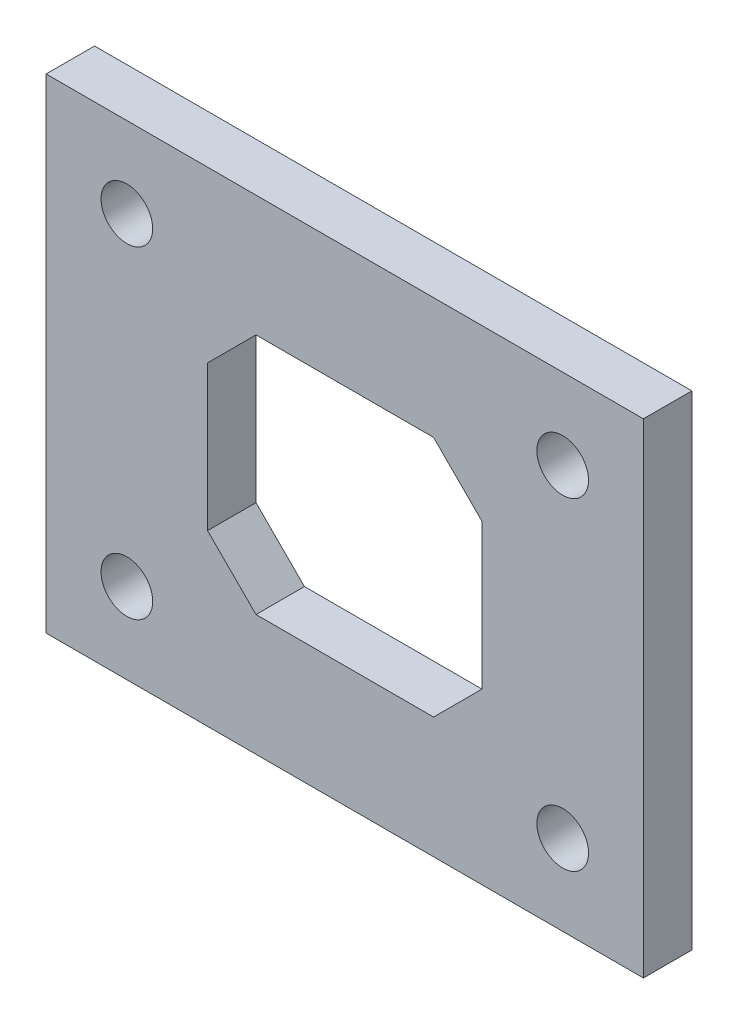
ISO-10303-21;
HEADER;
FILE_DESCRIPTION(('STEP AP214'),'2;1');
FILE_NAME('part.step','',(''),(''),'','','');
FILE_SCHEMA(('AUTOMOTIVE_DESIGN { 1 0 10303 214 1 1 1 1 }'));
ENDSEC;
DATA;
#1=APPLICATION_CONTEXT('core data for automotive mechanical design processes');
#2=APPLICATION_PROTOCOL_DEFINITION('international standard','automotive_design',2000,#1);
#3=PRODUCT_CONTEXT('',#1,'mechanical');
#4=PRODUCT('Part','Part','',(#3));
#5=PRODUCT_RELATED_PRODUCT_CATEGORY('part','',(#4));
#6=PRODUCT_DEFINITION_FORMATION('','',#4);
#7=PRODUCT_DEFINITION_CONTEXT('part definition',#1,'design');
#8=PRODUCT_DEFINITION('design','',#6,#7);
#9=PRODUCT_DEFINITION_SHAPE('','',#8);
#10=(LENGTH_UNIT() NAMED_UNIT(*) SI_UNIT(.MILLI.,.METRE.));
#11=(NAMED_UNIT(*) PLANE_ANGLE_UNIT() SI_UNIT($,.RADIAN.));
#12=(NAMED_UNIT(*) SI_UNIT($,.STERADIAN.) SOLID_ANGLE_UNIT());
#13=UNCERTAINTY_MEASURE_WITH_UNIT(LENGTH_MEASURE(1.E-05),#10,'distance_accuracy_value','');
#14=(GEOMETRIC_REPRESENTATION_CONTEXT(3) GLOBAL_UNCERTAINTY_ASSIGNED_CONTEXT((#13)) GLOBAL_UNIT_ASSIGNED_CONTEXT((#10,
#11,#12)) REPRESENTATION_CONTEXT('',''));
#15=CARTESIAN_POINT('',(0.,0.,0.));
#16=DIRECTION('',(0.,0.,1.));
#17=DIRECTION('',(1.,0.,0.));
#18=AXIS2_PLACEMENT_3D('',#15,#16,#17);
#19=CARTESIAN_POINT('',(18.5,0.,3.));
#20=DIRECTION('',(-1.,0.,0.));
#21=DIRECTION('',(0.,0.,1.));
#22=AXIS2_PLACEMENT_3D('',#19,#20,#21);
#23=PLANE('',#22);
#24=DIRECTION('',(0.,1.,0.));
#25=VECTOR('',#24,1.);
#26=CARTESIAN_POINT('',(18.5,0.,3.));
#27=LINE('',#26,#25);
#28=CARTESIAN_POINT('',(18.5,30.,3.));
#29=VERTEX_POINT('',#28);
#30=CARTESIAN_POINT('',(18.5,60.,3.));
#31=VERTEX_POINT('',#30);
#32=EDGE_CURVE('E143',#29,#31,#27,.T.);
#33=ORIENTED_EDGE('',*,*,#32,.F.);
#34=DIRECTION('',(0.,0.,1.));
#35=VECTOR('',#34,1.);
#36=CARTESIAN_POINT('',(18.5,30.,0.));
#37=LINE('',#36,#35);
#38=CARTESIAN_POINT('',(18.5,30.,0.));
#39=VERTEX_POINT('',#38);
#40=EDGE_CURVE('E129',#39,#29,#37,.T.);
#41=ORIENTED_EDGE('',*,*,#40,.F.);
#42=DIRECTION('',(0.,1.,0.));
#43=VECTOR('',#42,1.);
#44=CARTESIAN_POINT('',(18.5,0.,0.));
#45=LINE('',#44,#43);
#46=CARTESIAN_POINT('',(18.5,60.,0.));
#47=VERTEX_POINT('',#46);
#48=EDGE_CURVE('E141',#39,#47,#45,.T.);
#49=ORIENTED_EDGE('',*,*,#48,.T.);
#50=DIRECTION('',(0.,0.,-1.));
#51=VECTOR('',#50,1.);
#52=CARTESIAN_POINT('',(18.5,60.,3.));
#53=LINE('',#52,#51);
#54=EDGE_CURVE('E163',#31,#47,#53,.T.);
#55=ORIENTED_EDGE('',*,*,#54,.F.);
#56=EDGE_LOOP('',(#33,#41,#49,#55));
#57=FACE_BOUND('',#56,.T.);
#58=ADVANCED_FACE('F37',(#57),#23,.F.);
#59=CARTESIAN_POINT('',(0.,60.,3.));
#60=DIRECTION('',(0.,1.,0.));
#61=DIRECTION('',(0.,0.,1.));
#62=AXIS2_PLACEMENT_3D('',#59,#60,#61);
#63=PLANE('',#62);
#64=DIRECTION('',(1.,0.,0.));
#65=VECTOR('',#64,1.);
#66=CARTESIAN_POINT('',(0.,60.,0.));
#67=LINE('',#66,#65);
#68=CARTESIAN_POINT('',(-18.5,60.,0.));
#69=VERTEX_POINT('',#68);
#70=EDGE_CURVE('E148',#69,#47,#67,.T.);
#71=ORIENTED_EDGE('',*,*,#70,.F.);
#72=DIRECTION('',(0.,0.,-1.));
#73=VECTOR('',#72,1.);
#74=CARTESIAN_POINT('',(-18.5,60.,3.));
#75=LINE('',#74,#73);
#76=CARTESIAN_POINT('',(-18.5,60.,3.));
#77=VERTEX_POINT('',#76);
#78=EDGE_CURVE('E160',#77,#69,#75,.T.);
#79=ORIENTED_EDGE('',*,*,#78,.F.);
#80=DIRECTION('',(1.,0.,0.));
#81=VECTOR('',#80,1.);
#82=CARTESIAN_POINT('',(0.,60.,3.));
#83=LINE('',#82,#81);
#84=EDGE_CURVE('E244',#77,#31,#83,.T.);
#85=ORIENTED_EDGE('',*,*,#84,.T.);
#86=ORIENTED_EDGE('',*,*,#54,.T.);
#87=EDGE_LOOP('',(#71,#79,#85,#86));
#88=FACE_BOUND('',#87,.T.);
#89=ADVANCED_FACE('F270',(#88),#63,.T.);
#90=CARTESIAN_POINT('',(-13.5,55.,3.));
#91=DIRECTION('',(0.,0.,-1.));
#92=DIRECTION('',(-1.,0.,0.));
#93=AXIS2_PLACEMENT_3D('',#90,#91,#92);
#94=CYLINDRICAL_SURFACE('',#93,1.6);
#95=CARTESIAN_POINT('',(-13.5,55.,3.));
#96=DIRECTION('',(0.,0.,1.));
#97=DIRECTION('',(1.,0.,0.));
#98=AXIS2_PLACEMENT_3D('',#95,#96,#97);
#99=CIRCLE('',#98,1.6);
#100=CARTESIAN_POINT('',(-11.9,55.,3.));
#101=VERTEX_POINT('',#100);
#102=EDGE_CURVE('E240',#101,#101,#99,.T.);
#103=ORIENTED_EDGE('',*,*,#102,.T.);
#104=EDGE_LOOP('',(#103));
#105=FACE_BOUND('',#104,.T.);
#106=CARTESIAN_POINT('',(-13.5,55.,0.));
#107=DIRECTION('',(0.,0.,1.));
#108=DIRECTION('',(1.,0.,0.));
#109=AXIS2_PLACEMENT_3D('',#106,#107,#108);
#110=CIRCLE('',#109,1.6);
#111=CARTESIAN_POINT('',(-11.9,55.,0.));
#112=VERTEX_POINT('',#111);
#113=EDGE_CURVE('E149',#112,#112,#110,.T.);
#114=ORIENTED_EDGE('',*,*,#113,.F.);
#115=EDGE_LOOP('',(#114));
#116=FACE_BOUND('',#115,.T.);
#117=ADVANCED_FACE('F260',(#105,#116),#94,.F.);
#118=CARTESIAN_POINT('',(-13.5,35.,3.));
#119=DIRECTION('',(0.,0.,-1.));
#120=DIRECTION('',(-1.,0.,0.));
#121=AXIS2_PLACEMENT_3D('',#118,#119,#120);
#122=CYLINDRICAL_SURFACE('',#121,1.6);
#123=CARTESIAN_POINT('',(-13.5,35.,3.));
#124=DIRECTION('',(0.,0.,1.));
#125=DIRECTION('',(1.,0.,0.));
#126=AXIS2_PLACEMENT_3D('',#123,#124,#125);
#127=CIRCLE('',#126,1.6);
#128=CARTESIAN_POINT('',(-11.9,35.,3.));
#129=VERTEX_POINT('',#128);
#130=EDGE_CURVE('E237',#129,#129,#127,.T.);
#131=ORIENTED_EDGE('',*,*,#130,.T.);
#132=EDGE_LOOP('',(#131));
#133=FACE_BOUND('',#132,.T.);
#134=CARTESIAN_POINT('',(-13.5,35.,0.));
#135=DIRECTION('',(0.,0.,1.));
#136=DIRECTION('',(1.,0.,0.));
#137=AXIS2_PLACEMENT_3D('',#134,#135,#136);
#138=CIRCLE('',#137,1.6);
#139=CARTESIAN_POINT('',(-11.9,35.,0.));
#140=VERTEX_POINT('',#139);
#141=EDGE_CURVE('E154',#140,#140,#138,.T.);
#142=ORIENTED_EDGE('',*,*,#141,.F.);
#143=EDGE_LOOP('',(#142));
#144=FACE_BOUND('',#143,.T.);
#145=ADVANCED_FACE('F257',(#133,#144),#122,.F.);
#146=CARTESIAN_POINT('',(13.5,55.,3.));
#147=DIRECTION('',(0.,0.,-1.));
#148=DIRECTION('',(-1.,0.,0.));
#149=AXIS2_PLACEMENT_3D('',#146,#147,#148);
#150=CYLINDRICAL_SURFACE('',#149,1.6);
#151=CARTESIAN_POINT('',(13.5,55.,3.));
#152=DIRECTION('',(0.,0.,1.));
#153=DIRECTION('',(1.,0.,0.));
#154=AXIS2_PLACEMENT_3D('',#151,#152,#153);
#155=CIRCLE('',#154,1.6);
#156=CARTESIAN_POINT('',(15.1,55.,3.));
#157=VERTEX_POINT('',#156);
#158=EDGE_CURVE('E234',#157,#157,#155,.T.);
#159=ORIENTED_EDGE('',*,*,#158,.T.);
#160=EDGE_LOOP('',(#159));
#161=FACE_BOUND('',#160,.T.);
#162=CARTESIAN_POINT('',(13.5,55.,0.));
#163=DIRECTION('',(0.,0.,1.));
#164=DIRECTION('',(1.,0.,0.));
#165=AXIS2_PLACEMENT_3D('',#162,#163,#164);
#166=CIRCLE('',#165,1.6);
#167=CARTESIAN_POINT('',(15.1,55.,0.));
#168=VERTEX_POINT('',#167);
#169=EDGE_CURVE('E250',#168,#168,#166,.T.);
#170=ORIENTED_EDGE('',*,*,#169,.F.);
#171=EDGE_LOOP('',(#170));
#172=FACE_BOUND('',#171,.T.);
#173=ADVANCED_FACE('F259',(#161,#172),#150,.F.);
#174=CARTESIAN_POINT('',(13.5,35.,3.));
#175=DIRECTION('',(0.,0.,-1.));
#176=DIRECTION('',(-1.,0.,0.));
#177=AXIS2_PLACEMENT_3D('',#174,#175,#176);
#178=CYLINDRICAL_SURFACE('',#177,1.6);
#179=CARTESIAN_POINT('',(13.5,35.,3.));
#180=DIRECTION('',(0.,0.,1.));
#181=DIRECTION('',(1.,0.,0.));
#182=AXIS2_PLACEMENT_3D('',#179,#180,#181);
#183=CIRCLE('',#182,1.6);
#184=CARTESIAN_POINT('',(15.1,35.,3.));
#185=VERTEX_POINT('',#184);
#186=EDGE_CURVE('E159',#185,#185,#183,.T.);
#187=ORIENTED_EDGE('',*,*,#186,.T.);
#188=EDGE_LOOP('',(#187));
#189=FACE_BOUND('',#188,.T.);
#190=CARTESIAN_POINT('',(13.5,35.,0.));
#191=DIRECTION('',(0.,0.,1.));
#192=DIRECTION('',(1.,0.,0.));
#193=AXIS2_PLACEMENT_3D('',#190,#191,#192);
#194=CIRCLE('',#193,1.6);
#195=CARTESIAN_POINT('',(15.1,35.,0.));
#196=VERTEX_POINT('',#195);
#197=EDGE_CURVE('E230',#196,#196,#194,.T.);
#198=ORIENTED_EDGE('',*,*,#197,.F.);
#199=EDGE_LOOP('',(#198));
#200=FACE_BOUND('',#199,.T.);
#201=ADVANCED_FACE('F267',(#189,#200),#178,.F.);
#202=CARTESIAN_POINT('',(-18.5,0.,3.));
#203=DIRECTION('',(-1.,0.,0.));
#204=DIRECTION('',(0.,0.,1.));
#205=AXIS2_PLACEMENT_3D('',#202,#203,#204);
#206=PLANE('',#205);
#207=DIRECTION('',(0.,0.,1.));
#208=VECTOR('',#207,1.);
#209=CARTESIAN_POINT('',(-18.5,30.,0.));
#210=LINE('',#209,#208);
#211=CARTESIAN_POINT('',(-18.5,30.,0.));
#212=VERTEX_POINT('',#211);
#213=CARTESIAN_POINT('',(-18.5,30.,3.));
#214=VERTEX_POINT('',#213);
#215=EDGE_CURVE('E132',#212,#214,#210,.T.);
#216=ORIENTED_EDGE('',*,*,#215,.T.);
#217=DIRECTION('',(0.,1.,0.));
#218=VECTOR('',#217,1.);
#219=CARTESIAN_POINT('',(-18.5,0.,3.));
#220=LINE('',#219,#218);
#221=EDGE_CURVE('E164',#214,#77,#220,.T.);
#222=ORIENTED_EDGE('',*,*,#221,.T.);
#223=ORIENTED_EDGE('',*,*,#78,.T.);
#224=DIRECTION('',(0.,1.,0.));
#225=VECTOR('',#224,1.);
#226=CARTESIAN_POINT('',(-18.5,0.,0.));
#227=LINE('',#226,#225);
#228=EDGE_CURVE('E151',#212,#69,#227,.T.);
#229=ORIENTED_EDGE('',*,*,#228,.F.);
#230=EDGE_LOOP('',(#216,#222,#223,#229));
#231=FACE_BOUND('',#230,.T.);
#232=ADVANCED_FACE('F281',(#231),#206,.T.);
#233=CARTESIAN_POINT('',(0.,0.,3.));
#234=DIRECTION('',(0.,0.,1.));
#235=DIRECTION('',(1.,0.,0.));
#236=AXIS2_PLACEMENT_3D('',#233,#234,#235);
#237=PLANE('',#236);
#238=DIRECTION('',(1.,0.,0.));
#239=VECTOR('',#238,1.);
#240=CARTESIAN_POINT('',(8.50000000000001,52.5,3.));
#241=LINE('',#240,#239);
#242=CARTESIAN_POINT('',(-5.49999999999998,52.5,3.));
#243=VERTEX_POINT('',#242);
#244=CARTESIAN_POINT('',(5.50000000000001,52.5,3.));
#245=VERTEX_POINT('',#244);
#246=EDGE_CURVE('E214',#243,#245,#241,.T.);
#247=ORIENTED_EDGE('',*,*,#246,.T.);
#248=DIRECTION('',(-0.707106781186542,0.707106781186553,0.));
#249=VECTOR('',#248,1.);
#250=CARTESIAN_POINT('',(8.5,49.5,3.));
#251=LINE('',#250,#249);
#252=CARTESIAN_POINT('',(8.5,49.5,3.));
#253=VERTEX_POINT('',#252);
#254=EDGE_CURVE('E195',#245,#253,#251,.F.);
#255=ORIENTED_EDGE('',*,*,#254,.T.);
#256=DIRECTION('',(0.,-1.,0.));
#257=VECTOR('',#256,1.);
#258=CARTESIAN_POINT('',(8.50000000000001,52.5,3.));
#259=LINE('',#258,#257);
#260=CARTESIAN_POINT('',(8.5,40.5,3.));
#261=VERTEX_POINT('',#260);
#262=EDGE_CURVE('E228',#253,#261,#259,.T.);
#263=ORIENTED_EDGE('',*,*,#262,.T.);
#264=DIRECTION('',(0.707106781186552,0.707106781186543,0.));
#265=VECTOR('',#264,1.);
#266=CARTESIAN_POINT('',(5.49999999999998,37.5,3.));
#267=LINE('',#266,#265);
#268=CARTESIAN_POINT('',(5.49999999999998,37.5,3.));
#269=VERTEX_POINT('',#268);
#270=EDGE_CURVE('E191',#261,#269,#267,.F.);
#271=ORIENTED_EDGE('',*,*,#270,.T.);
#272=DIRECTION('',(-1.,0.,0.));
#273=VECTOR('',#272,1.);
#274=CARTESIAN_POINT('',(8.5,37.5,3.));
#275=LINE('',#274,#273);
#276=CARTESIAN_POINT('',(-5.50000000000002,37.5,3.));
#277=VERTEX_POINT('',#276);
#278=EDGE_CURVE('E219',#269,#277,#275,.T.);
#279=ORIENTED_EDGE('',*,*,#278,.T.);
#280=DIRECTION('',(0.707106781186543,-0.707106781186552,0.));
#281=VECTOR('',#280,1.);
#282=CARTESIAN_POINT('',(-8.5,40.5,3.));
#283=LINE('',#282,#281);
#284=CARTESIAN_POINT('',(-8.5,40.5,3.));
#285=VERTEX_POINT('',#284);
#286=EDGE_CURVE('E187',#277,#285,#283,.F.);
#287=ORIENTED_EDGE('',*,*,#286,.T.);
#288=DIRECTION('',(0.,1.,0.));
#289=VECTOR('',#288,1.);
#290=CARTESIAN_POINT('',(-8.49999999999999,52.5,3.));
#291=LINE('',#290,#289);
#292=CARTESIAN_POINT('',(-8.5,49.5,3.));
#293=VERTEX_POINT('',#292);
#294=EDGE_CURVE('E216',#285,#293,#291,.T.);
#295=ORIENTED_EDGE('',*,*,#294,.T.);
#296=DIRECTION('',(-0.707106781186552,-0.707106781186543,0.));
#297=VECTOR('',#296,1.);
#298=CARTESIAN_POINT('',(-5.49999999999997,52.5,3.));
#299=LINE('',#298,#297);
#300=EDGE_CURVE('E11',#293,#243,#299,.F.);
#301=ORIENTED_EDGE('',*,*,#300,.T.);
#302=EDGE_LOOP('',(#247,#255,#263,#271,#279,#287,#295,#301));
#303=FACE_BOUND('',#302,.T.);
#304=DIRECTION('',(-1.,0.,0.));
#305=VECTOR('',#304,1.);
#306=CARTESIAN_POINT('',(-18.5,30.,3.));
#307=LINE('',#306,#305);
#308=EDGE_CURVE('E136',#29,#214,#307,.T.);
#309=ORIENTED_EDGE('',*,*,#308,.F.);
#310=ORIENTED_EDGE('',*,*,#32,.T.);
#311=ORIENTED_EDGE('',*,*,#84,.F.);
#312=ORIENTED_EDGE('',*,*,#221,.F.);
#313=EDGE_LOOP('',(#309,#310,#311,#312));
#314=FACE_BOUND('',#313,.T.);
#315=ORIENTED_EDGE('',*,*,#186,.F.);
#316=EDGE_LOOP('',(#315));
#317=FACE_BOUND('',#316,.T.);
#318=ORIENTED_EDGE('',*,*,#158,.F.);
#319=EDGE_LOOP('',(#318));
#320=FACE_BOUND('',#319,.T.);
#321=ORIENTED_EDGE('',*,*,#130,.F.);
#322=EDGE_LOOP('',(#321));
#323=FACE_BOUND('',#322,.T.);
#324=ORIENTED_EDGE('',*,*,#102,.F.);
#325=EDGE_LOOP('',(#324));
#326=FACE_BOUND('',#325,.T.);
#327=ADVANCED_FACE('F284',(#303,#314,#317,#320,#323,#326),#237,.T.);
#328=CARTESIAN_POINT('',(0.,0.,0.));
#329=DIRECTION('',(0.,0.,1.));
#330=DIRECTION('',(1.,0.,0.));
#331=AXIS2_PLACEMENT_3D('',#328,#329,#330);
#332=PLANE('',#331);
#333=DIRECTION('',(-1.,0.,0.));
#334=VECTOR('',#333,1.);
#335=CARTESIAN_POINT('',(8.5,37.5,0.));
#336=LINE('',#335,#334);
#337=CARTESIAN_POINT('',(5.49999999999998,37.5,0.));
#338=VERTEX_POINT('',#337);
#339=CARTESIAN_POINT('',(-5.50000000000002,37.5,0.));
#340=VERTEX_POINT('',#339);
#341=EDGE_CURVE('E211',#338,#340,#336,.T.);
#342=ORIENTED_EDGE('',*,*,#341,.F.);
#343=DIRECTION('',(-0.707106781186552,-0.707106781186543,0.));
#344=VECTOR('',#343,1.);
#345=CARTESIAN_POINT('',(-16.,16.0000000000002,0.));
#346=LINE('',#345,#344);
#347=CARTESIAN_POINT('',(8.5,40.5,0.));
#348=VERTEX_POINT('',#347);
#349=EDGE_CURVE('E189',#338,#348,#346,.F.);
#350=ORIENTED_EDGE('',*,*,#349,.T.);
#351=DIRECTION('',(0.,-1.,0.));
#352=VECTOR('',#351,1.);
#353=CARTESIAN_POINT('',(8.50000000000001,52.5,0.));
#354=LINE('',#353,#352);
#355=CARTESIAN_POINT('',(8.5,49.5,0.));
#356=VERTEX_POINT('',#355);
#357=EDGE_CURVE('E223',#356,#348,#354,.T.);
#358=ORIENTED_EDGE('',*,*,#357,.F.);
#359=DIRECTION('',(0.707106781186542,-0.707106781186553,0.));
#360=VECTOR('',#359,1.);
#361=CARTESIAN_POINT('',(29.,28.9999999999996,0.));
#362=LINE('',#361,#360);
#363=CARTESIAN_POINT('',(5.50000000000001,52.5,0.));
#364=VERTEX_POINT('',#363);
#365=EDGE_CURVE('E193',#356,#364,#362,.F.);
#366=ORIENTED_EDGE('',*,*,#365,.T.);
#367=DIRECTION('',(1.,0.,0.));
#368=VECTOR('',#367,1.);
#369=CARTESIAN_POINT('',(8.50000000000001,52.5,0.));
#370=LINE('',#369,#368);
#371=CARTESIAN_POINT('',(-5.49999999999998,52.5,0.));
#372=VERTEX_POINT('',#371);
#373=EDGE_CURVE('E203',#372,#364,#370,.T.);
#374=ORIENTED_EDGE('',*,*,#373,.F.);
#375=DIRECTION('',(0.707106781186552,0.707106781186543,0.));
#376=VECTOR('',#375,1.);
#377=CARTESIAN_POINT('',(-28.9999999999999,29.0000000000003,0.));
#378=LINE('',#377,#376);
#379=CARTESIAN_POINT('',(-8.5,49.5,0.));
#380=VERTEX_POINT('',#379);
#381=EDGE_CURVE('E46',#372,#380,#378,.F.);
#382=ORIENTED_EDGE('',*,*,#381,.T.);
#383=DIRECTION('',(0.,1.,0.));
#384=VECTOR('',#383,1.);
#385=CARTESIAN_POINT('',(-8.49999999999999,52.5,0.));
#386=LINE('',#385,#384);
#387=CARTESIAN_POINT('',(-8.5,40.5,0.));
#388=VERTEX_POINT('',#387);
#389=EDGE_CURVE('E202',#388,#380,#386,.T.);
#390=ORIENTED_EDGE('',*,*,#389,.F.);
#391=DIRECTION('',(-0.707106781186543,0.707106781186552,0.));
#392=VECTOR('',#391,1.);
#393=CARTESIAN_POINT('',(15.9999999999999,15.9999999999997,0.));
#394=LINE('',#393,#392);
#395=EDGE_CURVE('E185',#388,#340,#394,.F.);
#396=ORIENTED_EDGE('',*,*,#395,.T.);
#397=EDGE_LOOP('',(#342,#350,#358,#366,#374,#382,#390,#396));
#398=FACE_BOUND('',#397,.T.);
#399=ORIENTED_EDGE('',*,*,#197,.T.);
#400=EDGE_LOOP('',(#399));
#401=FACE_BOUND('',#400,.T.);
#402=ORIENTED_EDGE('',*,*,#169,.T.);
#403=EDGE_LOOP('',(#402));
#404=FACE_BOUND('',#403,.T.);
#405=ORIENTED_EDGE('',*,*,#141,.T.);
#406=EDGE_LOOP('',(#405));
#407=FACE_BOUND('',#406,.T.);
#408=ORIENTED_EDGE('',*,*,#113,.T.);
#409=EDGE_LOOP('',(#408));
#410=FACE_BOUND('',#409,.T.);
#411=ORIENTED_EDGE('',*,*,#48,.F.);
#412=DIRECTION('',(-1.,0.,0.));
#413=VECTOR('',#412,1.);
#414=CARTESIAN_POINT('',(-18.5,30.,0.));
#415=LINE('',#414,#413);
#416=EDGE_CURVE('E126',#39,#212,#415,.T.);
#417=ORIENTED_EDGE('',*,*,#416,.T.);
#418=ORIENTED_EDGE('',*,*,#228,.T.);
#419=ORIENTED_EDGE('',*,*,#70,.T.);
#420=EDGE_LOOP('',(#411,#417,#418,#419));
#421=FACE_BOUND('',#420,.T.);
#422=ADVANCED_FACE('F146',(#398,#401,#404,#407,#410,#421),#332,.F.);
#423=CARTESIAN_POINT('',(-18.5,30.,0.));
#424=DIRECTION('',(0.,1.,0.));
#425=DIRECTION('',(0.,0.,1.));
#426=AXIS2_PLACEMENT_3D('',#423,#424,#425);
#427=PLANE('',#426);
#428=ORIENTED_EDGE('',*,*,#308,.T.);
#429=ORIENTED_EDGE('',*,*,#215,.F.);
#430=ORIENTED_EDGE('',*,*,#416,.F.);
#431=ORIENTED_EDGE('',*,*,#40,.T.);
#432=EDGE_LOOP('',(#428,#429,#430,#431));
#433=FACE_BOUND('',#432,.T.);
#434=ADVANCED_FACE('F128',(#433),#427,.F.);
#435=CARTESIAN_POINT('',(8.50000000000001,52.5,3.));
#436=DIRECTION('',(1.,0.,0.));
#437=DIRECTION('',(0.,1.,0.));
#438=AXIS2_PLACEMENT_3D('',#435,#436,#437);
#439=PLANE('',#438);
#440=ORIENTED_EDGE('',*,*,#357,.T.);
#441=DIRECTION('',(0.,0.,1.));
#442=VECTOR('',#441,1.);
#443=CARTESIAN_POINT('',(8.5,40.5,3.));
#444=LINE('',#443,#442);
#445=EDGE_CURVE('E179',#348,#261,#444,.T.);
#446=ORIENTED_EDGE('',*,*,#445,.T.);
#447=ORIENTED_EDGE('',*,*,#262,.F.);
#448=DIRECTION('',(0.,0.,-1.));
#449=VECTOR('',#448,1.);
#450=CARTESIAN_POINT('',(8.5,49.5,0.));
#451=LINE('',#450,#449);
#452=EDGE_CURVE('E176',#253,#356,#451,.T.);
#453=ORIENTED_EDGE('',*,*,#452,.T.);
#454=EDGE_LOOP('',(#440,#446,#447,#453));
#455=FACE_BOUND('',#454,.T.);
#456=ADVANCED_FACE('F292',(#455),#439,.F.);
#457=CARTESIAN_POINT('',(8.50000000000001,52.5,3.));
#458=DIRECTION('',(0.,1.,0.));
#459=DIRECTION('',(-1.,0.,0.));
#460=AXIS2_PLACEMENT_3D('',#457,#458,#459);
#461=PLANE('',#460);
#462=ORIENTED_EDGE('',*,*,#373,.T.);
#463=DIRECTION('',(0.,0.,1.));
#464=VECTOR('',#463,1.);
#465=CARTESIAN_POINT('',(5.50000000000001,52.5,3.));
#466=LINE('',#465,#464);
#467=EDGE_CURVE('E53',#364,#245,#466,.T.);
#468=ORIENTED_EDGE('',*,*,#467,.T.);
#469=ORIENTED_EDGE('',*,*,#246,.F.);
#470=DIRECTION('',(0.,0.,-1.));
#471=VECTOR('',#470,1.);
#472=CARTESIAN_POINT('',(-5.49999999999997,52.5,0.));
#473=LINE('',#472,#471);
#474=EDGE_CURVE('E181',#243,#372,#473,.T.);
#475=ORIENTED_EDGE('',*,*,#474,.T.);
#476=EDGE_LOOP('',(#462,#468,#469,#475));
#477=FACE_BOUND('',#476,.T.);
#478=ADVANCED_FACE('F213',(#477),#461,.F.);
#479=CARTESIAN_POINT('',(-8.49999999999999,52.5,3.));
#480=DIRECTION('',(-1.,0.,0.));
#481=DIRECTION('',(0.,-1.,0.));
#482=AXIS2_PLACEMENT_3D('',#479,#480,#481);
#483=PLANE('',#482);
#484=ORIENTED_EDGE('',*,*,#294,.F.);
#485=DIRECTION('',(0.,0.,-1.));
#486=VECTOR('',#485,1.);
#487=CARTESIAN_POINT('',(-8.5,40.5,0.));
#488=LINE('',#487,#486);
#489=EDGE_CURVE('E168',#285,#388,#488,.T.);
#490=ORIENTED_EDGE('',*,*,#489,.T.);
#491=ORIENTED_EDGE('',*,*,#389,.T.);
#492=DIRECTION('',(0.,0.,1.));
#493=VECTOR('',#492,1.);
#494=CARTESIAN_POINT('',(-8.5,49.5,3.));
#495=LINE('',#494,#493);
#496=EDGE_CURVE('E166',#380,#293,#495,.T.);
#497=ORIENTED_EDGE('',*,*,#496,.T.);
#498=EDGE_LOOP('',(#484,#490,#491,#497));
#499=FACE_BOUND('',#498,.T.);
#500=ADVANCED_FACE('F209',(#499),#483,.F.);
#501=CARTESIAN_POINT('',(8.5,37.5,3.));
#502=DIRECTION('',(0.,-1.,0.));
#503=DIRECTION('',(0.,0.,-1.));
#504=AXIS2_PLACEMENT_3D('',#501,#502,#503);
#505=PLANE('',#504);
#506=ORIENTED_EDGE('',*,*,#341,.T.);
#507=DIRECTION('',(0.,0.,1.));
#508=VECTOR('',#507,1.);
#509=CARTESIAN_POINT('',(-5.50000000000002,37.5,3.));
#510=LINE('',#509,#508);
#511=EDGE_CURVE('E174',#340,#277,#510,.T.);
#512=ORIENTED_EDGE('',*,*,#511,.T.);
#513=ORIENTED_EDGE('',*,*,#278,.F.);
#514=DIRECTION('',(0.,0.,-1.));
#515=VECTOR('',#514,1.);
#516=CARTESIAN_POINT('',(5.49999999999998,37.5,0.));
#517=LINE('',#516,#515);
#518=EDGE_CURVE('E171',#269,#338,#517,.T.);
#519=ORIENTED_EDGE('',*,*,#518,.T.);
#520=EDGE_LOOP('',(#506,#512,#513,#519));
#521=FACE_BOUND('',#520,.T.);
#522=ADVANCED_FACE('F296',(#521),#505,.F.);
#523=CARTESIAN_POINT('',(-8.5,40.5,3.));
#524=DIRECTION('',(0.707106781186552,0.707106781186543,0.));
#525=DIRECTION('',(0.,0.,1.));
#526=AXIS2_PLACEMENT_3D('',#523,#524,#525);
#527=PLANE('',#526);
#528=ORIENTED_EDGE('',*,*,#286,.F.);
#529=ORIENTED_EDGE('',*,*,#511,.F.);
#530=ORIENTED_EDGE('',*,*,#395,.F.);
#531=ORIENTED_EDGE('',*,*,#489,.F.);
#532=EDGE_LOOP('',(#528,#529,#530,#531));
#533=FACE_BOUND('',#532,.T.);
#534=ADVANCED_FACE('F299',(#533),#527,.T.);
#535=CARTESIAN_POINT('',(5.49999999999998,37.5,3.));
#536=DIRECTION('',(-0.707106781186543,0.707106781186552,0.));
#537=DIRECTION('',(0.,0.,1.));
#538=AXIS2_PLACEMENT_3D('',#535,#536,#537);
#539=PLANE('',#538);
#540=ORIENTED_EDGE('',*,*,#270,.F.);
#541=ORIENTED_EDGE('',*,*,#445,.F.);
#542=ORIENTED_EDGE('',*,*,#349,.F.);
#543=ORIENTED_EDGE('',*,*,#518,.F.);
#544=EDGE_LOOP('',(#540,#541,#542,#543));
#545=FACE_BOUND('',#544,.T.);
#546=ADVANCED_FACE('F322',(#545),#539,.T.);
#547=CARTESIAN_POINT('',(8.5,49.5,3.));
#548=DIRECTION('',(-0.707106781186552,-0.707106781186542,0.));
#549=DIRECTION('',(0.,0.,1.));
#550=AXIS2_PLACEMENT_3D('',#547,#548,#549);
#551=PLANE('',#550);
#552=ORIENTED_EDGE('',*,*,#254,.F.);
#553=ORIENTED_EDGE('',*,*,#467,.F.);
#554=ORIENTED_EDGE('',*,*,#365,.F.);
#555=ORIENTED_EDGE('',*,*,#452,.F.);
#556=EDGE_LOOP('',(#552,#553,#554,#555));
#557=FACE_BOUND('',#556,.T.);
#558=ADVANCED_FACE('F330',(#557),#551,.T.);
#559=CARTESIAN_POINT('',(-5.49999999999997,52.5,3.));
#560=DIRECTION('',(0.707106781186543,-0.707106781186552,0.));
#561=DIRECTION('',(0.,0.,1.));
#562=AXIS2_PLACEMENT_3D('',#559,#560,#561);
#563=PLANE('',#562);
#564=ORIENTED_EDGE('',*,*,#300,.F.);
#565=ORIENTED_EDGE('',*,*,#496,.F.);
#566=ORIENTED_EDGE('',*,*,#381,.F.);
#567=ORIENTED_EDGE('',*,*,#474,.F.);
#568=EDGE_LOOP('',(#564,#565,#566,#567));
#569=FACE_BOUND('',#568,.T.);
#570=ADVANCED_FACE('F40',(#569),#563,.T.);
#571=CLOSED_SHELL('',(#58,#89,#117,#145,#173,#201,#232,#327,#422,#434,#456,#478,#500,#522,#534,
#546,#558,#570));
#572=MANIFOLD_SOLID_BREP('B2',#571);
#573=ADVANCED_BREP_SHAPE_REPRESENTATION('',(#18,#572),#14);
#574=SHAPE_DEFINITION_REPRESENTATION(#9,#573);
ENDSEC;
END-ISO-10303-21;
